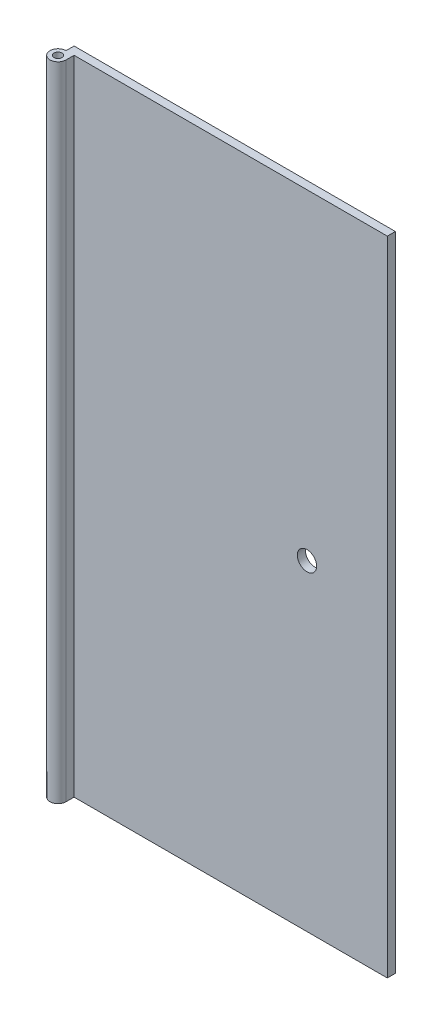
ISO-10303-21;
HEADER;
FILE_DESCRIPTION(('STEP AP214'),'2;1');
FILE_NAME('part.step','',(''),(''),'','','');
FILE_SCHEMA(('AUTOMOTIVE_DESIGN { 1 0 10303 214 1 1 1 1 }'));
ENDSEC;
DATA;
#1=APPLICATION_CONTEXT('core data for automotive mechanical design processes');
#2=APPLICATION_PROTOCOL_DEFINITION('international standard','automotive_design',2000,#1);
#3=PRODUCT_CONTEXT('',#1,'mechanical');
#4=PRODUCT('Part','Part','',(#3));
#5=PRODUCT_RELATED_PRODUCT_CATEGORY('part','',(#4));
#6=PRODUCT_DEFINITION_FORMATION('','',#4);
#7=PRODUCT_DEFINITION_CONTEXT('part definition',#1,'design');
#8=PRODUCT_DEFINITION('design','',#6,#7);
#9=PRODUCT_DEFINITION_SHAPE('','',#8);
#10=(LENGTH_UNIT() NAMED_UNIT(*) SI_UNIT(.MILLI.,.METRE.));
#11=(NAMED_UNIT(*) PLANE_ANGLE_UNIT() SI_UNIT($,.RADIAN.));
#12=(NAMED_UNIT(*) SI_UNIT($,.STERADIAN.) SOLID_ANGLE_UNIT());
#13=UNCERTAINTY_MEASURE_WITH_UNIT(LENGTH_MEASURE(1.E-05),#10,'distance_accuracy_value','');
#14=(GEOMETRIC_REPRESENTATION_CONTEXT(3) GLOBAL_UNCERTAINTY_ASSIGNED_CONTEXT((#13)) GLOBAL_UNIT_ASSIGNED_CONTEXT((#10,
#11,#12)) REPRESENTATION_CONTEXT('',''));
#15=CARTESIAN_POINT('',(0.,0.,0.));
#16=DIRECTION('',(0.,0.,1.));
#17=DIRECTION('',(1.,0.,0.));
#18=AXIS2_PLACEMENT_3D('',#15,#16,#17);
#19=CARTESIAN_POINT('',(0.,0.,2.));
#20=DIRECTION('',(0.,0.,1.));
#21=DIRECTION('',(-1.,0.,0.));
#22=AXIS2_PLACEMENT_3D('',#19,#20,#21);
#23=PLANE('',#22);
#24=CARTESIAN_POINT('',(30.,40.,2.));
#25=DIRECTION('',(0.,0.,1.));
#26=DIRECTION('',(1.,0.,0.));
#27=AXIS2_PLACEMENT_3D('',#24,#25,#26);
#28=CIRCLE('',#27,1.2);
#29=CARTESIAN_POINT('',(31.2,40.,2.));
#30=VERTEX_POINT('',#29);
#31=EDGE_CURVE('E142',#30,#30,#28,.T.);
#32=ORIENTED_EDGE('',*,*,#31,.F.);
#33=EDGE_LOOP('',(#32));
#34=FACE_BOUND('',#33,.T.);
#35=DIRECTION('',(-1.,0.,0.));
#36=VECTOR('',#35,1.);
#37=CARTESIAN_POINT('',(0.,80.,2.));
#38=LINE('',#37,#36);
#39=CARTESIAN_POINT('',(40.,80.,2.));
#40=VERTEX_POINT('',#39);
#41=CARTESIAN_POINT('',(1.,80.,2.));
#42=VERTEX_POINT('',#41);
#43=EDGE_CURVE('E56',#40,#42,#38,.T.);
#44=ORIENTED_EDGE('',*,*,#43,.T.);
#45=DIRECTION('',(0.,1.,0.));
#46=VECTOR('',#45,1.);
#47=CARTESIAN_POINT('',(1.,-2.82842712474618,2.));
#48=LINE('',#47,#46);
#49=CARTESIAN_POINT('',(1.,0.,2.));
#50=VERTEX_POINT('',#49);
#51=EDGE_CURVE('E125',#50,#42,#48,.T.);
#52=ORIENTED_EDGE('',*,*,#51,.F.);
#53=DIRECTION('',(1.,0.,0.));
#54=VECTOR('',#53,1.);
#55=CARTESIAN_POINT('',(0.,0.,2.));
#56=LINE('',#55,#54);
#57=CARTESIAN_POINT('',(40.,0.,2.));
#58=VERTEX_POINT('',#57);
#59=EDGE_CURVE('E108',#50,#58,#56,.T.);
#60=ORIENTED_EDGE('',*,*,#59,.T.);
#61=DIRECTION('',(0.,1.,0.));
#62=VECTOR('',#61,1.);
#63=CARTESIAN_POINT('',(40.,0.,2.));
#64=LINE('',#63,#62);
#65=EDGE_CURVE('E112',#58,#40,#64,.T.);
#66=ORIENTED_EDGE('',*,*,#65,.T.);
#67=EDGE_LOOP('',(#44,#52,#60,#66));
#68=FACE_BOUND('',#67,.T.);
#69=ADVANCED_FACE('F33',(#34,#68),#23,.T.);
#70=CARTESIAN_POINT('',(0.,0.,1.));
#71=DIRECTION('',(1.,0.,0.));
#72=DIRECTION('',(0.,0.,-1.));
#73=AXIS2_PLACEMENT_3D('',#70,#71,#72);
#74=PLANE('',#73);
#75=DIRECTION('',(0.,0.,-1.));
#76=VECTOR('',#75,1.);
#77=CARTESIAN_POINT('',(0.,80.,1.));
#78=LINE('',#77,#76);
#79=CARTESIAN_POINT('',(0.,80.,2.));
#80=VERTEX_POINT('',#79);
#81=CARTESIAN_POINT('',(0.,80.,1.));
#82=VERTEX_POINT('',#81);
#83=EDGE_CURVE('E106',#80,#82,#78,.T.);
#84=ORIENTED_EDGE('',*,*,#83,.T.);
#85=DIRECTION('',(0.,-1.,0.));
#86=VECTOR('',#85,1.);
#87=CARTESIAN_POINT('',(0.,0.,1.));
#88=LINE('',#87,#86);
#89=CARTESIAN_POINT('',(0.,0.,1.));
#90=VERTEX_POINT('',#89);
#91=EDGE_CURVE('E48',#82,#90,#88,.T.);
#92=ORIENTED_EDGE('',*,*,#91,.T.);
#93=DIRECTION('',(0.,0.,-1.));
#94=VECTOR('',#93,1.);
#95=CARTESIAN_POINT('',(0.,0.,1.));
#96=LINE('',#95,#94);
#97=CARTESIAN_POINT('',(0.,0.,2.));
#98=VERTEX_POINT('',#97);
#99=EDGE_CURVE('E11',#98,#90,#96,.T.);
#100=ORIENTED_EDGE('',*,*,#99,.F.);
#101=DIRECTION('',(0.,-1.,0.));
#102=VECTOR('',#101,1.);
#103=CARTESIAN_POINT('',(0.,0.,2.));
#104=LINE('',#103,#102);
#105=EDGE_CURVE('E115',#80,#98,#104,.T.);
#106=ORIENTED_EDGE('',*,*,#105,.F.);
#107=EDGE_LOOP('',(#84,#92,#100,#106));
#108=FACE_BOUND('',#107,.T.);
#109=ADVANCED_FACE('F35',(#108),#74,.F.);
#110=CARTESIAN_POINT('',(0.,0.,1.));
#111=DIRECTION('',(0.,1.,0.));
#112=DIRECTION('',(0.,0.,1.));
#113=AXIS2_PLACEMENT_3D('',#110,#111,#112);
#114=PLANE('',#113);
#115=ORIENTED_EDGE('',*,*,#99,.T.);
#116=DIRECTION('',(1.,0.,0.));
#117=VECTOR('',#116,1.);
#118=CARTESIAN_POINT('',(-1.,0.,1.));
#119=LINE('',#118,#117);
#120=CARTESIAN_POINT('',(40.,0.,1.));
#121=VERTEX_POINT('',#120);
#122=EDGE_CURVE('E93',#90,#121,#119,.T.);
#123=ORIENTED_EDGE('',*,*,#122,.T.);
#124=DIRECTION('',(0.,0.,-1.));
#125=VECTOR('',#124,1.);
#126=CARTESIAN_POINT('',(40.,0.,1.));
#127=LINE('',#126,#125);
#128=EDGE_CURVE('E41',#58,#121,#127,.T.);
#129=ORIENTED_EDGE('',*,*,#128,.F.);
#130=ORIENTED_EDGE('',*,*,#59,.F.);
#131=DIRECTION('',(0.,0.,-1.));
#132=VECTOR('',#131,1.);
#133=CARTESIAN_POINT('',(1.,0.,2.));
#134=LINE('',#133,#132);
#135=CARTESIAN_POINT('',(1.,0.,3.));
#136=VERTEX_POINT('',#135);
#137=EDGE_CURVE('E122',#136,#50,#134,.T.);
#138=ORIENTED_EDGE('',*,*,#137,.F.);
#139=CARTESIAN_POINT('',(0.,0.,3.));
#140=DIRECTION('',(0.,1.,0.));
#141=DIRECTION('',(0.,0.,1.));
#142=AXIS2_PLACEMENT_3D('',#139,#140,#141);
#143=CIRCLE('',#142,1.);
#144=EDGE_CURVE('E127',#98,#136,#143,.T.);
#145=ORIENTED_EDGE('',*,*,#144,.F.);
#146=EDGE_LOOP('',(#115,#123,#129,#130,#138,#145));
#147=FACE_BOUND('',#146,.T.);
#148=CARTESIAN_POINT('',(0.,0.,3.));
#149=DIRECTION('',(0.,1.,0.));
#150=DIRECTION('',(0.,0.,1.));
#151=AXIS2_PLACEMENT_3D('',#148,#149,#150);
#152=CIRCLE('',#151,0.5);
#153=CARTESIAN_POINT('',(0.,0.,3.5));
#154=VERTEX_POINT('',#153);
#155=EDGE_CURVE('E118',#154,#154,#152,.T.);
#156=ORIENTED_EDGE('',*,*,#155,.T.);
#157=EDGE_LOOP('',(#156));
#158=FACE_BOUND('',#157,.T.);
#159=ADVANCED_FACE('F169',(#147,#158),#114,.F.);
#160=CARTESIAN_POINT('',(40.,0.,1.));
#161=DIRECTION('',(-1.,0.,0.));
#162=DIRECTION('',(0.,0.,1.));
#163=AXIS2_PLACEMENT_3D('',#160,#161,#162);
#164=PLANE('',#163);
#165=ORIENTED_EDGE('',*,*,#128,.T.);
#166=DIRECTION('',(0.,-1.,0.));
#167=VECTOR('',#166,1.);
#168=CARTESIAN_POINT('',(40.,0.,1.));
#169=LINE('',#168,#167);
#170=CARTESIAN_POINT('',(40.,80.,1.));
#171=VERTEX_POINT('',#170);
#172=EDGE_CURVE('E88',#171,#121,#169,.T.);
#173=ORIENTED_EDGE('',*,*,#172,.F.);
#174=DIRECTION('',(0.,0.,-1.));
#175=VECTOR('',#174,1.);
#176=CARTESIAN_POINT('',(40.,80.,1.));
#177=LINE('',#176,#175);
#178=EDGE_CURVE('E99',#40,#171,#177,.T.);
#179=ORIENTED_EDGE('',*,*,#178,.F.);
#180=ORIENTED_EDGE('',*,*,#65,.F.);
#181=EDGE_LOOP('',(#165,#173,#179,#180));
#182=FACE_BOUND('',#181,.T.);
#183=ADVANCED_FACE('F97',(#182),#164,.F.);
#184=CARTESIAN_POINT('',(0.,80.,1.));
#185=DIRECTION('',(0.,-1.,0.));
#186=DIRECTION('',(0.,0.,-1.));
#187=AXIS2_PLACEMENT_3D('',#184,#185,#186);
#188=PLANE('',#187);
#189=ORIENTED_EDGE('',*,*,#178,.T.);
#190=DIRECTION('',(1.,0.,0.));
#191=VECTOR('',#190,1.);
#192=CARTESIAN_POINT('',(-1.,80.,1.));
#193=LINE('',#192,#191);
#194=EDGE_CURVE('E85',#82,#171,#193,.T.);
#195=ORIENTED_EDGE('',*,*,#194,.F.);
#196=ORIENTED_EDGE('',*,*,#83,.F.);
#197=CARTESIAN_POINT('',(0.,80.,3.));
#198=DIRECTION('',(0.,-1.,0.));
#199=DIRECTION('',(0.,0.,1.));
#200=AXIS2_PLACEMENT_3D('',#197,#198,#199);
#201=CIRCLE('',#200,1.);
#202=CARTESIAN_POINT('',(1.,80.,3.));
#203=VERTEX_POINT('',#202);
#204=EDGE_CURVE('E126',#203,#80,#201,.T.);
#205=ORIENTED_EDGE('',*,*,#204,.F.);
#206=DIRECTION('',(0.,0.,1.));
#207=VECTOR('',#206,1.);
#208=CARTESIAN_POINT('',(1.,80.,2.));
#209=LINE('',#208,#207);
#210=EDGE_CURVE('E121',#42,#203,#209,.T.);
#211=ORIENTED_EDGE('',*,*,#210,.F.);
#212=ORIENTED_EDGE('',*,*,#43,.F.);
#213=EDGE_LOOP('',(#189,#195,#196,#205,#211,#212));
#214=FACE_BOUND('',#213,.T.);
#215=CARTESIAN_POINT('',(0.,80.,3.));
#216=DIRECTION('',(0.,-1.,0.));
#217=DIRECTION('',(0.,0.,-1.));
#218=AXIS2_PLACEMENT_3D('',#215,#216,#217);
#219=CIRCLE('',#218,0.5);
#220=CARTESIAN_POINT('',(0.,80.,2.5));
#221=VERTEX_POINT('',#220);
#222=EDGE_CURVE('E131',#221,#221,#219,.T.);
#223=ORIENTED_EDGE('',*,*,#222,.T.);
#224=EDGE_LOOP('',(#223));
#225=FACE_BOUND('',#224,.T.);
#226=ADVANCED_FACE('F103',(#214,#225),#188,.F.);
#227=CARTESIAN_POINT('',(0.,-2.82842712474618,3.));
#228=DIRECTION('',(0.,1.,0.));
#229=DIRECTION('',(0.,0.,1.));
#230=AXIS2_PLACEMENT_3D('',#227,#228,#229);
#231=CYLINDRICAL_SURFACE('',#230,1.);
#232=ORIENTED_EDGE('',*,*,#105,.T.);
#233=ORIENTED_EDGE('',*,*,#144,.T.);
#234=DIRECTION('',(0.,1.,0.));
#235=VECTOR('',#234,1.);
#236=CARTESIAN_POINT('',(1.,-2.82842712474618,3.));
#237=LINE('',#236,#235);
#238=EDGE_CURVE('E130',#136,#203,#237,.T.);
#239=ORIENTED_EDGE('',*,*,#238,.T.);
#240=ORIENTED_EDGE('',*,*,#204,.T.);
#241=EDGE_LOOP('',(#232,#233,#239,#240));
#242=FACE_BOUND('',#241,.T.);
#243=ADVANCED_FACE('F176',(#242),#231,.T.);
#244=CARTESIAN_POINT('',(1.,-2.82842712474618,2.));
#245=DIRECTION('',(-1.,0.,0.));
#246=DIRECTION('',(0.,0.,1.));
#247=AXIS2_PLACEMENT_3D('',#244,#245,#246);
#248=PLANE('',#247);
#249=ORIENTED_EDGE('',*,*,#238,.F.);
#250=ORIENTED_EDGE('',*,*,#137,.T.);
#251=ORIENTED_EDGE('',*,*,#51,.T.);
#252=ORIENTED_EDGE('',*,*,#210,.T.);
#253=EDGE_LOOP('',(#249,#250,#251,#252));
#254=FACE_BOUND('',#253,.T.);
#255=ADVANCED_FACE('F159',(#254),#248,.F.);
#256=CARTESIAN_POINT('',(0.,-2.82842712474618,3.));
#257=DIRECTION('',(0.,1.,0.));
#258=DIRECTION('',(0.,0.,1.));
#259=AXIS2_PLACEMENT_3D('',#256,#257,#258);
#260=CYLINDRICAL_SURFACE('',#259,0.5);
#261=ORIENTED_EDGE('',*,*,#155,.F.);
#262=EDGE_LOOP('',(#261));
#263=FACE_BOUND('',#262,.T.);
#264=ORIENTED_EDGE('',*,*,#222,.F.);
#265=EDGE_LOOP('',(#264));
#266=FACE_BOUND('',#265,.T.);
#267=ADVANCED_FACE('F152',(#263,#266),#260,.F.);
#268=CARTESIAN_POINT('',(-1.,0.,1.));
#269=DIRECTION('',(0.,0.,1.));
#270=DIRECTION('',(1.,0.,0.));
#271=AXIS2_PLACEMENT_3D('',#268,#269,#270);
#272=PLANE('',#271);
#273=CARTESIAN_POINT('',(30.,40.,1.));
#274=DIRECTION('',(0.,0.,1.));
#275=DIRECTION('',(1.,0.,0.));
#276=AXIS2_PLACEMENT_3D('',#273,#274,#275);
#277=CIRCLE('',#276,1.2);
#278=CARTESIAN_POINT('',(31.2,40.,1.));
#279=VERTEX_POINT('',#278);
#280=EDGE_CURVE('E101',#279,#279,#277,.F.);
#281=ORIENTED_EDGE('',*,*,#280,.F.);
#282=EDGE_LOOP('',(#281));
#283=FACE_BOUND('',#282,.T.);
#284=ORIENTED_EDGE('',*,*,#194,.T.);
#285=ORIENTED_EDGE('',*,*,#172,.T.);
#286=ORIENTED_EDGE('',*,*,#122,.F.);
#287=ORIENTED_EDGE('',*,*,#91,.F.);
#288=EDGE_LOOP('',(#284,#285,#286,#287));
#289=FACE_BOUND('',#288,.T.);
#290=ADVANCED_FACE('F87',(#283,#289),#272,.F.);
#291=CARTESIAN_POINT('',(30.,40.,2.));
#292=DIRECTION('',(0.,0.,1.));
#293=DIRECTION('',(1.,0.,0.));
#294=AXIS2_PLACEMENT_3D('',#291,#292,#293);
#295=CYLINDRICAL_SURFACE('',#294,1.2);
#296=ORIENTED_EDGE('',*,*,#280,.T.);
#297=EDGE_LOOP('',(#296));
#298=FACE_BOUND('',#297,.T.);
#299=ORIENTED_EDGE('',*,*,#31,.T.);
#300=EDGE_LOOP('',(#299));
#301=FACE_BOUND('',#300,.T.);
#302=ADVANCED_FACE('F148',(#298,#301),#295,.F.);
#303=CLOSED_SHELL('',(#69,#109,#159,#183,#226,#243,#255,#267,#290,#302));
#304=MANIFOLD_SOLID_BREP('B2',#303);
#305=ADVANCED_BREP_SHAPE_REPRESENTATION('',(#18,#304),#14);
#306=SHAPE_DEFINITION_REPRESENTATION(#9,#305);
ENDSEC;
END-ISO-10303-21;
